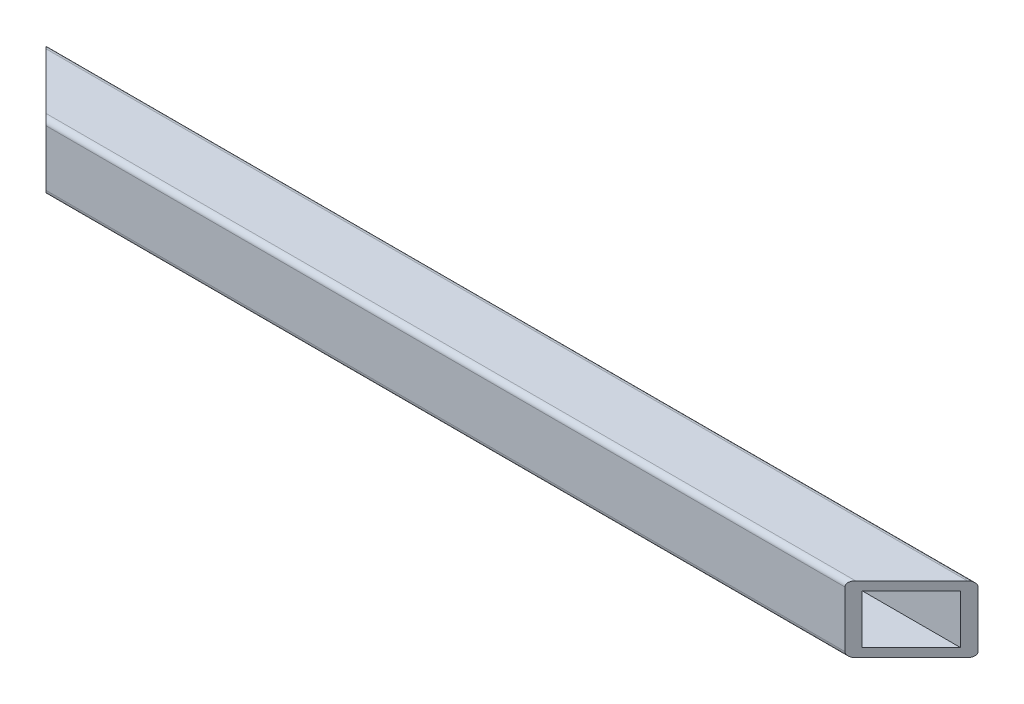
ISO-10303-21;
HEADER;
FILE_DESCRIPTION(('STEP AP214'),'2;1');
FILE_NAME('part.step','',(''),(''),'','','');
FILE_SCHEMA(('AUTOMOTIVE_DESIGN { 1 0 10303 214 1 1 1 1 }'));
ENDSEC;
DATA;
#1=APPLICATION_CONTEXT('core data for automotive mechanical design processes');
#2=APPLICATION_PROTOCOL_DEFINITION('international standard','automotive_design',2000,#1);
#3=PRODUCT_CONTEXT('',#1,'mechanical');
#4=PRODUCT('Part','Part','',(#3));
#5=PRODUCT_RELATED_PRODUCT_CATEGORY('part','',(#4));
#6=PRODUCT_DEFINITION_FORMATION('','',#4);
#7=PRODUCT_DEFINITION_CONTEXT('part definition',#1,'design');
#8=PRODUCT_DEFINITION('design','',#6,#7);
#9=PRODUCT_DEFINITION_SHAPE('','',#8);
#10=(LENGTH_UNIT() NAMED_UNIT(*) SI_UNIT(.MILLI.,.METRE.));
#11=(NAMED_UNIT(*) PLANE_ANGLE_UNIT() SI_UNIT($,.RADIAN.));
#12=(NAMED_UNIT(*) SI_UNIT($,.STERADIAN.) SOLID_ANGLE_UNIT());
#13=UNCERTAINTY_MEASURE_WITH_UNIT(LENGTH_MEASURE(1.E-05),#10,'distance_accuracy_value','');
#14=(GEOMETRIC_REPRESENTATION_CONTEXT(3) GLOBAL_UNCERTAINTY_ASSIGNED_CONTEXT((#13)) GLOBAL_UNIT_ASSIGNED_CONTEXT((#10,
#11,#12)) REPRESENTATION_CONTEXT('',''));
#15=CARTESIAN_POINT('',(0.,0.,0.));
#16=DIRECTION('',(0.,0.,1.));
#17=DIRECTION('',(1.,0.,0.));
#18=AXIS2_PLACEMENT_3D('',#15,#16,#17);
#19=CARTESIAN_POINT('',(177.8,20.574,20.574));
#20=DIRECTION('',(0.,0.,-1.));
#21=DIRECTION('',(0.,1.,0.));
#22=AXIS2_PLACEMENT_3D('',#19,#20,#21);
#23=PLANE('',#22);
#24=DIRECTION('',(0.,1.,0.));
#25=VECTOR('',#24,1.);
#26=CARTESIAN_POINT('',(11.049,9.52399999999999,20.574));
#27=LINE('',#26,#25);
#28=CARTESIAN_POINT('',(11.049,11.176,20.574));
#29=VERTEX_POINT('',#28);
#30=CARTESIAN_POINT('',(11.049,20.574,20.574));
#31=VERTEX_POINT('',#30);
#32=EDGE_CURVE('E196',#29,#31,#27,.T.);
#33=ORIENTED_EDGE('',*,*,#32,.T.);
#34=DIRECTION('',(-1.,0.,0.));
#35=VECTOR('',#34,1.);
#36=CARTESIAN_POINT('',(177.8,20.574,20.574));
#37=LINE('',#36,#35);
#38=CARTESIAN_POINT('',(166.751,20.574,20.574));
#39=VERTEX_POINT('',#38);
#40=EDGE_CURVE('E46',#39,#31,#37,.T.);
#41=ORIENTED_EDGE('',*,*,#40,.F.);
#42=DIRECTION('',(0.,-1.,0.));
#43=VECTOR('',#42,1.);
#44=CARTESIAN_POINT('',(166.751,9.52399999999999,20.574));
#45=LINE('',#44,#43);
#46=CARTESIAN_POINT('',(166.751,11.176,20.574));
#47=VERTEX_POINT('',#46);
#48=EDGE_CURVE('E194',#39,#47,#45,.T.);
#49=ORIENTED_EDGE('',*,*,#48,.T.);
#50=DIRECTION('',(-1.,0.,0.));
#51=VECTOR('',#50,1.);
#52=CARTESIAN_POINT('',(177.8,11.176,20.574));
#53=LINE('',#52,#51);
#54=EDGE_CURVE('E172',#47,#29,#53,.T.);
#55=ORIENTED_EDGE('',*,*,#54,.T.);
#56=EDGE_LOOP('',(#33,#41,#49,#55));
#57=FACE_BOUND('',#56,.T.);
#58=ADVANCED_FACE('F43',(#57),#23,.T.);
#59=CARTESIAN_POINT('',(177.8,20.574,11.176));
#60=DIRECTION('',(0.,-1.,0.));
#61=DIRECTION('',(0.,0.,-1.));
#62=AXIS2_PLACEMENT_3D('',#59,#60,#61);
#63=PLANE('',#62);
#64=DIRECTION('',(-0.707106781186548,0.,-0.707106781186548));
#65=VECTOR('',#64,1.);
#66=CARTESIAN_POINT('',(12.7,20.574,22.225));
#67=LINE('',#66,#65);
#68=CARTESIAN_POINT('',(1.65100000000003,20.574,11.176));
#69=VERTEX_POINT('',#68);
#70=EDGE_CURVE('E189',#31,#69,#67,.T.);
#71=ORIENTED_EDGE('',*,*,#70,.T.);
#72=DIRECTION('',(-1.,0.,0.));
#73=VECTOR('',#72,1.);
#74=CARTESIAN_POINT('',(177.8,20.574,11.176));
#75=LINE('',#74,#73);
#76=CARTESIAN_POINT('',(176.149,20.574,11.176));
#77=VERTEX_POINT('',#76);
#78=EDGE_CURVE('E177',#77,#69,#75,.T.);
#79=ORIENTED_EDGE('',*,*,#78,.F.);
#80=DIRECTION('',(-0.707106781186547,0.,0.707106781186548));
#81=VECTOR('',#80,1.);
#82=CARTESIAN_POINT('',(165.1,20.574,22.225));
#83=LINE('',#82,#81);
#84=EDGE_CURVE('E190',#77,#39,#83,.T.);
#85=ORIENTED_EDGE('',*,*,#84,.T.);
#86=ORIENTED_EDGE('',*,*,#40,.T.);
#87=EDGE_LOOP('',(#71,#79,#85,#86));
#88=FACE_BOUND('',#87,.T.);
#89=ADVANCED_FACE('F188',(#88),#63,.T.);
#90=CARTESIAN_POINT('',(177.8,11.176,11.176));
#91=DIRECTION('',(0.,0.,1.));
#92=DIRECTION('',(1.,0.,0.));
#93=AXIS2_PLACEMENT_3D('',#90,#91,#92);
#94=PLANE('',#93);
#95=DIRECTION('',(0.,-1.,0.));
#96=VECTOR('',#95,1.);
#97=CARTESIAN_POINT('',(1.651,9.52399999999999,11.176));
#98=LINE('',#97,#96);
#99=CARTESIAN_POINT('',(1.65100000000001,11.176,11.176));
#100=VERTEX_POINT('',#99);
#101=EDGE_CURVE('E200',#69,#100,#98,.T.);
#102=ORIENTED_EDGE('',*,*,#101,.T.);
#103=DIRECTION('',(-1.,0.,0.));
#104=VECTOR('',#103,1.);
#105=CARTESIAN_POINT('',(177.8,11.176,11.176));
#106=LINE('',#105,#104);
#107=CARTESIAN_POINT('',(176.149,11.176,11.176));
#108=VERTEX_POINT('',#107);
#109=EDGE_CURVE('E143',#108,#100,#106,.T.);
#110=ORIENTED_EDGE('',*,*,#109,.F.);
#111=DIRECTION('',(0.,1.,0.));
#112=VECTOR('',#111,1.);
#113=CARTESIAN_POINT('',(176.149,9.52399999999999,11.176));
#114=LINE('',#113,#112);
#115=EDGE_CURVE('E222',#108,#77,#114,.T.);
#116=ORIENTED_EDGE('',*,*,#115,.T.);
#117=ORIENTED_EDGE('',*,*,#78,.T.);
#118=EDGE_LOOP('',(#102,#110,#116,#117));
#119=FACE_BOUND('',#118,.T.);
#120=ADVANCED_FACE('F271',(#119),#94,.T.);
#121=CARTESIAN_POINT('',(177.8,11.176,20.574));
#122=DIRECTION('',(0.,1.,0.));
#123=DIRECTION('',(0.,0.,1.));
#124=AXIS2_PLACEMENT_3D('',#121,#122,#123);
#125=PLANE('',#124);
#126=DIRECTION('',(0.707106781186548,0.,0.707106781186548));
#127=VECTOR('',#126,1.);
#128=CARTESIAN_POINT('',(12.7,11.176,22.225));
#129=LINE('',#128,#127);
#130=EDGE_CURVE('E154',#100,#29,#129,.T.);
#131=ORIENTED_EDGE('',*,*,#130,.T.);
#132=ORIENTED_EDGE('',*,*,#54,.F.);
#133=DIRECTION('',(0.707106781186547,0.,-0.707106781186548));
#134=VECTOR('',#133,1.);
#135=CARTESIAN_POINT('',(165.1,11.176,22.225));
#136=LINE('',#135,#134);
#137=EDGE_CURVE('E219',#47,#108,#136,.T.);
#138=ORIENTED_EDGE('',*,*,#137,.T.);
#139=ORIENTED_EDGE('',*,*,#109,.T.);
#140=EDGE_LOOP('',(#131,#132,#138,#139));
#141=FACE_BOUND('',#140,.T.);
#142=ADVANCED_FACE('F275',(#141),#125,.T.);
#143=CARTESIAN_POINT('',(165.1,9.52399999999999,22.225));
#144=DIRECTION('',(-0.707106781186548,0.,-0.707106781186547));
#145=DIRECTION('',(-0.707106781186547,0.,0.707106781186548));
#146=AXIS2_PLACEMENT_3D('',#143,#144,#145);
#147=PLANE('',#146);
#148=ORIENTED_EDGE('',*,*,#48,.F.);
#149=ORIENTED_EDGE('',*,*,#84,.F.);
#150=ORIENTED_EDGE('',*,*,#115,.F.);
#151=ORIENTED_EDGE('',*,*,#137,.F.);
#152=EDGE_LOOP('',(#148,#149,#150,#151));
#153=FACE_BOUND('',#152,.T.);
#154=CARTESIAN_POINT('',(166.116,10.541,21.209));
#155=DIRECTION('',(-0.707106781186548,0.,-0.707106781186547));
#156=DIRECTION('',(-0.707106781186547,0.,0.707106781186548));
#157=AXIS2_PLACEMENT_3D('',#154,#155,#156);
#158=ELLIPSE('',#157,1.43684097937106,1.016);
#159=CARTESIAN_POINT('',(165.1,10.541,22.225));
#160=VERTEX_POINT('',#159);
#161=CARTESIAN_POINT('',(166.116,9.525,21.209));
#162=VERTEX_POINT('',#161);
#163=EDGE_CURVE('E213',#160,#162,#158,.F.);
#164=ORIENTED_EDGE('',*,*,#163,.T.);
#165=DIRECTION('',(0.707106781186547,0.,-0.707106781186548));
#166=VECTOR('',#165,1.);
#167=CARTESIAN_POINT('',(165.1,9.525,22.225));
#168=LINE('',#167,#166);
#169=CARTESIAN_POINT('',(176.784,9.525,10.541));
#170=VERTEX_POINT('',#169);
#171=EDGE_CURVE('E215',#162,#170,#168,.T.);
#172=ORIENTED_EDGE('',*,*,#171,.T.);
#173=CARTESIAN_POINT('',(176.784,10.541,10.541));
#174=DIRECTION('',(-0.707106781186548,0.,-0.707106781186547));
#175=DIRECTION('',(-0.707106781186547,0.,0.707106781186548));
#176=AXIS2_PLACEMENT_3D('',#173,#174,#175);
#177=ELLIPSE('',#176,1.43684097937106,1.016);
#178=CARTESIAN_POINT('',(177.8,10.541,9.525));
#179=VERTEX_POINT('',#178);
#180=EDGE_CURVE('E217',#170,#179,#177,.F.);
#181=ORIENTED_EDGE('',*,*,#180,.T.);
#182=DIRECTION('',(0.,1.,0.));
#183=VECTOR('',#182,1.);
#184=CARTESIAN_POINT('',(177.8,10.541,9.525));
#185=LINE('',#184,#183);
#186=CARTESIAN_POINT('',(177.8,21.209,9.525));
#187=VERTEX_POINT('',#186);
#188=EDGE_CURVE('E142',#179,#187,#185,.T.);
#189=ORIENTED_EDGE('',*,*,#188,.T.);
#190=CARTESIAN_POINT('',(176.784,21.209,10.541));
#191=DIRECTION('',(-0.707106781186548,0.,-0.707106781186547));
#192=DIRECTION('',(-0.707106781186547,0.,0.707106781186548));
#193=AXIS2_PLACEMENT_3D('',#190,#191,#192);
#194=ELLIPSE('',#193,1.43684097937106,1.016);
#195=CARTESIAN_POINT('',(176.784,22.225,10.541));
#196=VERTEX_POINT('',#195);
#197=EDGE_CURVE('E230',#187,#196,#194,.F.);
#198=ORIENTED_EDGE('',*,*,#197,.T.);
#199=DIRECTION('',(-0.707106781186547,0.,0.707106781186548));
#200=VECTOR('',#199,1.);
#201=CARTESIAN_POINT('',(165.1,22.225,22.225));
#202=LINE('',#201,#200);
#203=CARTESIAN_POINT('',(166.116,22.225,21.209));
#204=VERTEX_POINT('',#203);
#205=EDGE_CURVE('E228',#196,#204,#202,.T.);
#206=ORIENTED_EDGE('',*,*,#205,.T.);
#207=CARTESIAN_POINT('',(166.116,21.209,21.209));
#208=DIRECTION('',(-0.707106781186548,0.,-0.707106781186547));
#209=DIRECTION('',(-0.707106781186547,0.,0.707106781186548));
#210=AXIS2_PLACEMENT_3D('',#207,#208,#209);
#211=ELLIPSE('',#210,1.43684097937107,1.016);
#212=CARTESIAN_POINT('',(165.1,21.209,22.225));
#213=VERTEX_POINT('',#212);
#214=EDGE_CURVE('E59',#204,#213,#211,.F.);
#215=ORIENTED_EDGE('',*,*,#214,.T.);
#216=DIRECTION('',(0.,1.,0.));
#217=VECTOR('',#216,1.);
#218=CARTESIAN_POINT('',(165.1,9.52399999999999,22.225));
#219=LINE('',#218,#217);
#220=EDGE_CURVE('E226',#160,#213,#219,.T.);
#221=ORIENTED_EDGE('',*,*,#220,.F.);
#222=EDGE_LOOP('',(#164,#172,#181,#189,#198,#206,#215,#221));
#223=FACE_BOUND('',#222,.T.);
#224=ADVANCED_FACE('F255',(#153,#223),#147,.F.);
#225=CARTESIAN_POINT('',(12.7,9.52399999999999,22.225));
#226=DIRECTION('',(0.707106781186548,0.,-0.707106781186548));
#227=DIRECTION('',(-0.707106781186548,0.,-0.707106781186548));
#228=AXIS2_PLACEMENT_3D('',#225,#226,#227);
#229=PLANE('',#228);
#230=ORIENTED_EDGE('',*,*,#101,.F.);
#231=ORIENTED_EDGE('',*,*,#70,.F.);
#232=ORIENTED_EDGE('',*,*,#32,.F.);
#233=ORIENTED_EDGE('',*,*,#130,.F.);
#234=EDGE_LOOP('',(#230,#231,#232,#233));
#235=FACE_BOUND('',#234,.T.);
#236=CARTESIAN_POINT('',(11.684,10.541,21.209));
#237=DIRECTION('',(0.707106781186548,0.,-0.707106781186548));
#238=DIRECTION('',(-0.707106781186548,0.,-0.707106781186548));
#239=AXIS2_PLACEMENT_3D('',#236,#237,#238);
#240=ELLIPSE('',#239,1.43684097937106,1.016);
#241=CARTESIAN_POINT('',(11.684,9.525,21.209));
#242=VERTEX_POINT('',#241);
#243=CARTESIAN_POINT('',(12.7,10.541,22.225));
#244=VERTEX_POINT('',#243);
#245=EDGE_CURVE('E67',#242,#244,#240,.F.);
#246=ORIENTED_EDGE('',*,*,#245,.T.);
#247=DIRECTION('',(0.,1.,0.));
#248=VECTOR('',#247,1.);
#249=CARTESIAN_POINT('',(12.7,9.52399999999999,22.225));
#250=LINE('',#249,#248);
#251=CARTESIAN_POINT('',(12.7,21.209,22.225));
#252=VERTEX_POINT('',#251);
#253=EDGE_CURVE('E175',#244,#252,#250,.T.);
#254=ORIENTED_EDGE('',*,*,#253,.T.);
#255=CARTESIAN_POINT('',(11.684,21.209,21.209));
#256=DIRECTION('',(0.707106781186548,0.,-0.707106781186548));
#257=DIRECTION('',(-0.707106781186548,0.,-0.707106781186548));
#258=AXIS2_PLACEMENT_3D('',#255,#256,#257);
#259=ELLIPSE('',#258,1.43684097937107,1.016);
#260=CARTESIAN_POINT('',(11.684,22.225,21.209));
#261=VERTEX_POINT('',#260);
#262=EDGE_CURVE('E202',#252,#261,#259,.F.);
#263=ORIENTED_EDGE('',*,*,#262,.T.);
#264=DIRECTION('',(-0.707106781186547,0.,-0.707106781186547));
#265=VECTOR('',#264,1.);
#266=CARTESIAN_POINT('',(12.7,22.225,22.225));
#267=LINE('',#266,#265);
#268=CARTESIAN_POINT('',(1.01599999999999,22.225,10.541));
#269=VERTEX_POINT('',#268);
#270=EDGE_CURVE('E210',#261,#269,#267,.T.);
#271=ORIENTED_EDGE('',*,*,#270,.T.);
#272=CARTESIAN_POINT('',(1.01599999999996,21.209,10.541));
#273=DIRECTION('',(0.707106781186548,0.,-0.707106781186548));
#274=DIRECTION('',(-0.707106781186548,0.,-0.707106781186548));
#275=AXIS2_PLACEMENT_3D('',#272,#273,#274);
#276=ELLIPSE('',#275,1.43684097937106,1.016);
#277=CARTESIAN_POINT('',(0.,21.209,9.525));
#278=VERTEX_POINT('',#277);
#279=EDGE_CURVE('E137',#269,#278,#276,.F.);
#280=ORIENTED_EDGE('',*,*,#279,.T.);
#281=DIRECTION('',(0.,1.,0.));
#282=VECTOR('',#281,1.);
#283=CARTESIAN_POINT('',(0.,10.541,9.525));
#284=LINE('',#283,#282);
#285=CARTESIAN_POINT('',(0.,10.541,9.525));
#286=VERTEX_POINT('',#285);
#287=EDGE_CURVE('E131',#286,#278,#284,.T.);
#288=ORIENTED_EDGE('',*,*,#287,.F.);
#289=CARTESIAN_POINT('',(1.01599999999996,10.541,10.541));
#290=DIRECTION('',(0.707106781186548,0.,-0.707106781186548));
#291=DIRECTION('',(-0.707106781186548,0.,-0.707106781186548));
#292=AXIS2_PLACEMENT_3D('',#289,#290,#291);
#293=ELLIPSE('',#292,1.43684097937106,1.016);
#294=CARTESIAN_POINT('',(1.01599999999996,9.525,10.541));
#295=VERTEX_POINT('',#294);
#296=EDGE_CURVE('E134',#286,#295,#293,.F.);
#297=ORIENTED_EDGE('',*,*,#296,.T.);
#298=DIRECTION('',(0.707106781186548,0.,0.707106781186548));
#299=VECTOR('',#298,1.);
#300=CARTESIAN_POINT('',(12.7,9.525,22.225));
#301=LINE('',#300,#299);
#302=EDGE_CURVE('E153',#295,#242,#301,.T.);
#303=ORIENTED_EDGE('',*,*,#302,.T.);
#304=EDGE_LOOP('',(#246,#254,#263,#271,#280,#288,#297,#303));
#305=FACE_BOUND('',#304,.T.);
#306=ADVANCED_FACE('F133',(#235,#305),#229,.F.);
#307=CARTESIAN_POINT('',(177.8,10.541,21.209));
#308=DIRECTION('',(-1.,0.,0.));
#309=DIRECTION('',(0.,0.,1.));
#310=AXIS2_PLACEMENT_3D('',#307,#308,#309);
#311=CYLINDRICAL_SURFACE('',#310,1.016);
#312=DIRECTION('',(-1.,0.,0.));
#313=VECTOR('',#312,1.);
#314=CARTESIAN_POINT('',(177.8,10.541,22.225));
#315=LINE('',#314,#313);
#316=EDGE_CURVE('E171',#160,#244,#315,.T.);
#317=ORIENTED_EDGE('',*,*,#316,.T.);
#318=ORIENTED_EDGE('',*,*,#245,.F.);
#319=DIRECTION('',(-1.,0.,0.));
#320=VECTOR('',#319,1.);
#321=CARTESIAN_POINT('',(177.8,9.525,21.209));
#322=LINE('',#321,#320);
#323=EDGE_CURVE('E11',#162,#242,#322,.T.);
#324=ORIENTED_EDGE('',*,*,#323,.F.);
#325=ORIENTED_EDGE('',*,*,#163,.F.);
#326=EDGE_LOOP('',(#317,#318,#324,#325));
#327=FACE_BOUND('',#326,.T.);
#328=ADVANCED_FACE('F238',(#327),#311,.T.);
#329=CARTESIAN_POINT('',(177.8,9.525,21.209));
#330=DIRECTION('',(0.,1.,0.));
#331=DIRECTION('',(0.,0.,1.));
#332=AXIS2_PLACEMENT_3D('',#329,#330,#331);
#333=PLANE('',#332);
#334=ORIENTED_EDGE('',*,*,#323,.T.);
#335=ORIENTED_EDGE('',*,*,#302,.F.);
#336=DIRECTION('',(-1.,0.,0.));
#337=VECTOR('',#336,1.);
#338=CARTESIAN_POINT('',(177.8,9.525,10.541));
#339=LINE('',#338,#337);
#340=EDGE_CURVE('E51',#170,#295,#339,.T.);
#341=ORIENTED_EDGE('',*,*,#340,.F.);
#342=ORIENTED_EDGE('',*,*,#171,.F.);
#343=EDGE_LOOP('',(#334,#335,#341,#342));
#344=FACE_BOUND('',#343,.T.);
#345=ADVANCED_FACE('F258',(#344),#333,.F.);
#346=CARTESIAN_POINT('',(177.8,10.541,10.541));
#347=DIRECTION('',(-1.,0.,0.));
#348=DIRECTION('',(0.,0.,1.));
#349=AXIS2_PLACEMENT_3D('',#346,#347,#348);
#350=CYLINDRICAL_SURFACE('',#349,1.016);
#351=ORIENTED_EDGE('',*,*,#340,.T.);
#352=ORIENTED_EDGE('',*,*,#296,.F.);
#353=DIRECTION('',(-1.,0.,0.));
#354=VECTOR('',#353,1.);
#355=CARTESIAN_POINT('',(177.8,10.541,9.525));
#356=LINE('',#355,#354);
#357=EDGE_CURVE('E150',#179,#286,#356,.T.);
#358=ORIENTED_EDGE('',*,*,#357,.F.);
#359=ORIENTED_EDGE('',*,*,#180,.F.);
#360=EDGE_LOOP('',(#351,#352,#358,#359));
#361=FACE_BOUND('',#360,.T.);
#362=ADVANCED_FACE('F148',(#361),#350,.T.);
#363=CARTESIAN_POINT('',(177.8,10.541,9.525));
#364=DIRECTION('',(0.,0.,1.));
#365=DIRECTION('',(1.,0.,0.));
#366=AXIS2_PLACEMENT_3D('',#363,#364,#365);
#367=PLANE('',#366);
#368=ORIENTED_EDGE('',*,*,#287,.T.);
#369=DIRECTION('',(-1.,0.,0.));
#370=VECTOR('',#369,1.);
#371=CARTESIAN_POINT('',(177.8,21.209,9.525));
#372=LINE('',#371,#370);
#373=EDGE_CURVE('E157',#187,#278,#372,.T.);
#374=ORIENTED_EDGE('',*,*,#373,.F.);
#375=ORIENTED_EDGE('',*,*,#188,.F.);
#376=ORIENTED_EDGE('',*,*,#357,.T.);
#377=EDGE_LOOP('',(#368,#374,#375,#376));
#378=FACE_BOUND('',#377,.T.);
#379=ADVANCED_FACE('F156',(#378),#367,.F.);
#380=CARTESIAN_POINT('',(177.8,21.209,10.541));
#381=DIRECTION('',(-1.,0.,0.));
#382=DIRECTION('',(0.,0.,1.));
#383=AXIS2_PLACEMENT_3D('',#380,#381,#382);
#384=CYLINDRICAL_SURFACE('',#383,1.016);
#385=ORIENTED_EDGE('',*,*,#373,.T.);
#386=ORIENTED_EDGE('',*,*,#279,.F.);
#387=DIRECTION('',(-1.,0.,0.));
#388=VECTOR('',#387,1.);
#389=CARTESIAN_POINT('',(177.8,22.225,10.541));
#390=LINE('',#389,#388);
#391=EDGE_CURVE('E160',#196,#269,#390,.T.);
#392=ORIENTED_EDGE('',*,*,#391,.F.);
#393=ORIENTED_EDGE('',*,*,#197,.F.);
#394=EDGE_LOOP('',(#385,#386,#392,#393));
#395=FACE_BOUND('',#394,.T.);
#396=ADVANCED_FACE('F253',(#395),#384,.T.);
#397=CARTESIAN_POINT('',(177.8,22.225,10.541));
#398=DIRECTION('',(0.,-1.,0.));
#399=DIRECTION('',(0.,0.,-1.));
#400=AXIS2_PLACEMENT_3D('',#397,#398,#399);
#401=PLANE('',#400);
#402=ORIENTED_EDGE('',*,*,#391,.T.);
#403=ORIENTED_EDGE('',*,*,#270,.F.);
#404=DIRECTION('',(-1.,0.,0.));
#405=VECTOR('',#404,1.);
#406=CARTESIAN_POINT('',(177.8,22.225,21.209));
#407=LINE('',#406,#405);
#408=EDGE_CURVE('E165',#204,#261,#407,.T.);
#409=ORIENTED_EDGE('',*,*,#408,.F.);
#410=ORIENTED_EDGE('',*,*,#205,.F.);
#411=EDGE_LOOP('',(#402,#403,#409,#410));
#412=FACE_BOUND('',#411,.T.);
#413=ADVANCED_FACE('F250',(#412),#401,.F.);
#414=CARTESIAN_POINT('',(177.8,21.209,21.209));
#415=DIRECTION('',(-1.,0.,0.));
#416=DIRECTION('',(0.,0.,1.));
#417=AXIS2_PLACEMENT_3D('',#414,#415,#416);
#418=CYLINDRICAL_SURFACE('',#417,1.016);
#419=ORIENTED_EDGE('',*,*,#408,.T.);
#420=ORIENTED_EDGE('',*,*,#262,.F.);
#421=DIRECTION('',(-1.,0.,0.));
#422=VECTOR('',#421,1.);
#423=CARTESIAN_POINT('',(177.8,21.209,22.225));
#424=LINE('',#423,#422);
#425=EDGE_CURVE('E168',#213,#252,#424,.T.);
#426=ORIENTED_EDGE('',*,*,#425,.F.);
#427=ORIENTED_EDGE('',*,*,#214,.F.);
#428=EDGE_LOOP('',(#419,#420,#426,#427));
#429=FACE_BOUND('',#428,.T.);
#430=ADVANCED_FACE('F246',(#429),#418,.T.);
#431=CARTESIAN_POINT('',(177.8,21.209,22.225));
#432=DIRECTION('',(0.,0.,-1.));
#433=DIRECTION('',(0.,1.,0.));
#434=AXIS2_PLACEMENT_3D('',#431,#432,#433);
#435=PLANE('',#434);
#436=ORIENTED_EDGE('',*,*,#425,.T.);
#437=ORIENTED_EDGE('',*,*,#253,.F.);
#438=ORIENTED_EDGE('',*,*,#316,.F.);
#439=ORIENTED_EDGE('',*,*,#220,.T.);
#440=EDGE_LOOP('',(#436,#437,#438,#439));
#441=FACE_BOUND('',#440,.T.);
#442=ADVANCED_FACE('F241',(#441),#435,.F.);
#443=CLOSED_SHELL('',(#58,#89,#120,#142,#224,#306,#328,#345,#362,#379,#396,#413,#430,#442));
#444=MANIFOLD_SOLID_BREP('B2',#443);
#445=ADVANCED_BREP_SHAPE_REPRESENTATION('',(#18,#444),#14);
#446=SHAPE_DEFINITION_REPRESENTATION(#9,#445);
ENDSEC;
END-ISO-10303-21;
